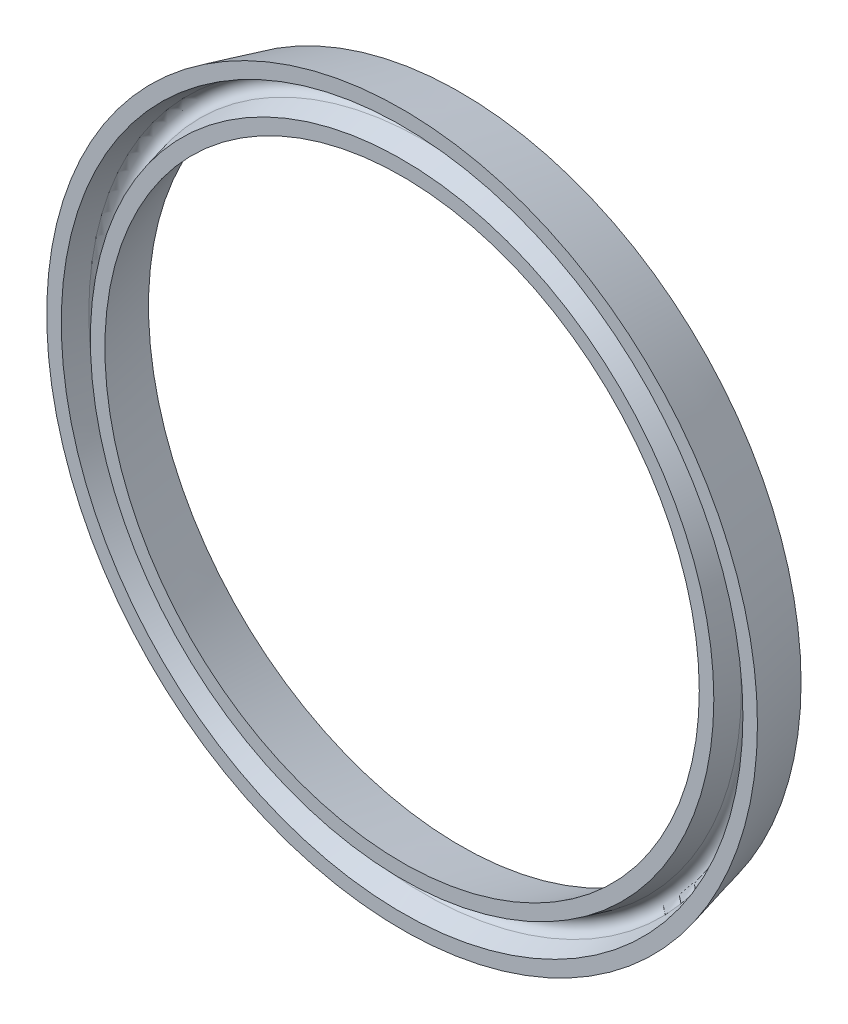
ISO-10303-21;
HEADER;
FILE_DESCRIPTION(('STEP AP214'),'2;1');
FILE_NAME('part.step','',(''),(''),'','','');
FILE_SCHEMA(('AUTOMOTIVE_DESIGN { 1 0 10303 214 1 1 1 1 }'));
ENDSEC;
DATA;
#1=APPLICATION_CONTEXT('core data for automotive mechanical design processes');
#2=APPLICATION_PROTOCOL_DEFINITION('international standard','automotive_design',2000,#1);
#3=PRODUCT_CONTEXT('',#1,'mechanical');
#4=PRODUCT('Part','Part','',(#3));
#5=PRODUCT_RELATED_PRODUCT_CATEGORY('part','',(#4));
#6=PRODUCT_DEFINITION_FORMATION('','',#4);
#7=PRODUCT_DEFINITION_CONTEXT('part definition',#1,'design');
#8=PRODUCT_DEFINITION('design','',#6,#7);
#9=PRODUCT_DEFINITION_SHAPE('','',#8);
#10=(LENGTH_UNIT() NAMED_UNIT(*) SI_UNIT(.MILLI.,.METRE.));
#11=(NAMED_UNIT(*) PLANE_ANGLE_UNIT() SI_UNIT($,.RADIAN.));
#12=(NAMED_UNIT(*) SI_UNIT($,.STERADIAN.) SOLID_ANGLE_UNIT());
#13=UNCERTAINTY_MEASURE_WITH_UNIT(LENGTH_MEASURE(1.E-05),#10,'distance_accuracy_value','');
#14=(GEOMETRIC_REPRESENTATION_CONTEXT(3) GLOBAL_UNCERTAINTY_ASSIGNED_CONTEXT((#13)) GLOBAL_UNIT_ASSIGNED_CONTEXT((#10,
#11,#12)) REPRESENTATION_CONTEXT('',''));
#15=CARTESIAN_POINT('',(0.,0.,0.));
#16=DIRECTION('',(0.,0.,1.));
#17=DIRECTION('',(1.,0.,0.));
#18=AXIS2_PLACEMENT_3D('',#15,#16,#17);
#19=CARTESIAN_POINT('',(-67.31,0.,6.));
#20=DIRECTION('',(0.,0.,-1.));
#21=DIRECTION('',(-1.,0.,0.));
#22=AXIS2_PLACEMENT_3D('',#19,#20,#21);
#23=CONICAL_SURFACE('',#22,64.31,0.244978663126864);
#24=CARTESIAN_POINT('',(-67.31,0.,1.455213750218));
#25=DIRECTION('',(0.,0.,1.));
#26=DIRECTION('',(1.,0.,0.));
#27=AXIS2_PLACEMENT_3D('',#24,#25,#26);
#28=CIRCLE('',#27,65.4461965624455);
#29=CARTESIAN_POINT('',(-1.8638034375545,0.,1.455213750218));
#30=VERTEX_POINT('',#29);
#31=EDGE_CURVE('E10',#30,#30,#28,.T.);
#32=ORIENTED_EDGE('',*,*,#31,.T.);
#33=EDGE_LOOP('',(#32));
#34=FACE_BOUND('',#33,.T.);
#35=CARTESIAN_POINT('',(-67.31,0.,6.));
#36=DIRECTION('',(0.,0.,1.));
#37=DIRECTION('',(1.,0.,0.));
#38=AXIS2_PLACEMENT_3D('',#35,#36,#37);
#39=CIRCLE('',#38,64.31);
#40=CARTESIAN_POINT('',(-3.,0.,6.));
#41=VERTEX_POINT('',#40);
#42=EDGE_CURVE('E76',#41,#41,#39,.T.);
#43=ORIENTED_EDGE('',*,*,#42,.F.);
#44=EDGE_LOOP('',(#43));
#45=FACE_BOUND('',#44,.T.);
#46=ADVANCED_FACE('F41',(#34,#45),#23,.T.);
#47=CARTESIAN_POINT('',(-67.31,0.,1.92116460960662));
#48=DIRECTION('',(0.,0.,1.));
#49=DIRECTION('',(1.,0.,0.));
#50=AXIS2_PLACEMENT_3D('',#47,#48,#49);
#51=TOROIDAL_SURFACE('',#50,67.31,1.92116460960662);
#52=CARTESIAN_POINT('',(-67.31,0.,1.455213750218));
#53=DIRECTION('',(0.,0.,1.));
#54=DIRECTION('',(1.,0.,0.));
#55=AXIS2_PLACEMENT_3D('',#52,#53,#54);
#56=CIRCLE('',#55,69.1738034375545);
#57=CARTESIAN_POINT('',(1.8638034375545,0.,1.455213750218));
#58=VERTEX_POINT('',#57);
#59=EDGE_CURVE('E48',#58,#58,#56,.T.);
#60=ORIENTED_EDGE('',*,*,#59,.T.);
#61=EDGE_LOOP('',(#60));
#62=FACE_BOUND('',#61,.T.);
#63=ORIENTED_EDGE('',*,*,#31,.F.);
#64=EDGE_LOOP('',(#63));
#65=FACE_BOUND('',#64,.T.);
#66=ADVANCED_FACE('F85',(#62,#65),#51,.F.);
#67=CARTESIAN_POINT('',(-67.31,0.,1.455213750218));
#68=DIRECTION('',(0.,0.,1.));
#69=DIRECTION('',(1.,0.,0.));
#70=AXIS2_PLACEMENT_3D('',#67,#68,#69);
#71=CONICAL_SURFACE('',#70,69.1738034375545,0.244978663126864);
#72=CARTESIAN_POINT('',(-67.31,0.,6.));
#73=DIRECTION('',(0.,0.,1.));
#74=DIRECTION('',(1.,0.,0.));
#75=AXIS2_PLACEMENT_3D('',#72,#73,#74);
#76=CIRCLE('',#75,70.31);
#77=CARTESIAN_POINT('',(3.,0.,6.));
#78=VERTEX_POINT('',#77);
#79=EDGE_CURVE('E53',#78,#78,#76,.T.);
#80=ORIENTED_EDGE('',*,*,#79,.T.);
#81=EDGE_LOOP('',(#80));
#82=FACE_BOUND('',#81,.T.);
#83=ORIENTED_EDGE('',*,*,#59,.F.);
#84=EDGE_LOOP('',(#83));
#85=FACE_BOUND('',#84,.T.);
#86=ADVANCED_FACE('F89',(#82,#85),#71,.F.);
#87=CARTESIAN_POINT('',(0.,0.,6.));
#88=DIRECTION('',(0.,0.,1.));
#89=DIRECTION('',(1.,0.,0.));
#90=AXIS2_PLACEMENT_3D('',#87,#88,#89);
#91=PLANE('',#90);
#92=CARTESIAN_POINT('',(-67.31,0.,6.));
#93=DIRECTION('',(0.,0.,1.));
#94=DIRECTION('',(1.,0.,0.));
#95=AXIS2_PLACEMENT_3D('',#92,#93,#94);
#96=CIRCLE('',#95,73.31);
#97=CARTESIAN_POINT('',(6.00000000000001,0.,6.));
#98=VERTEX_POINT('',#97);
#99=EDGE_CURVE('E58',#98,#98,#96,.T.);
#100=ORIENTED_EDGE('',*,*,#99,.T.);
#101=EDGE_LOOP('',(#100));
#102=FACE_BOUND('',#101,.T.);
#103=ORIENTED_EDGE('',*,*,#79,.F.);
#104=EDGE_LOOP('',(#103));
#105=FACE_BOUND('',#104,.T.);
#106=ADVANCED_FACE('F93',(#102,#105),#91,.T.);
#107=CARTESIAN_POINT('',(-67.31,0.,-6.));
#108=DIRECTION('',(0.,0.,1.));
#109=DIRECTION('',(1.,0.,0.));
#110=AXIS2_PLACEMENT_3D('',#107,#108,#109);
#111=CONICAL_SURFACE('',#110,70.31,0.244978663126864);
#112=ORIENTED_EDGE('',*,*,#99,.F.);
#113=EDGE_LOOP('',(#112));
#114=FACE_BOUND('',#113,.T.);
#115=CARTESIAN_POINT('',(-67.31,0.,-6.));
#116=DIRECTION('',(0.,0.,1.));
#117=DIRECTION('',(1.,0.,0.));
#118=AXIS2_PLACEMENT_3D('',#115,#116,#117);
#119=CIRCLE('',#118,70.31);
#120=CARTESIAN_POINT('',(3.,0.,-6.));
#121=VERTEX_POINT('',#120);
#122=EDGE_CURVE('E64',#121,#121,#119,.T.);
#123=ORIENTED_EDGE('',*,*,#122,.T.);
#124=EDGE_LOOP('',(#123));
#125=FACE_BOUND('',#124,.T.);
#126=ADVANCED_FACE('F100',(#114,#125),#111,.T.);
#127=CARTESIAN_POINT('',(0.,0.,-6.));
#128=DIRECTION('',(0.,0.,1.));
#129=DIRECTION('',(1.,0.,0.));
#130=AXIS2_PLACEMENT_3D('',#127,#128,#129);
#131=PLANE('',#130);
#132=ORIENTED_EDGE('',*,*,#122,.F.);
#133=EDGE_LOOP('',(#132));
#134=FACE_BOUND('',#133,.T.);
#135=CARTESIAN_POINT('',(-67.31,0.,-6.));
#136=DIRECTION('',(0.,0.,1.));
#137=DIRECTION('',(1.,0.,0.));
#138=AXIS2_PLACEMENT_3D('',#135,#136,#137);
#139=CIRCLE('',#138,64.31);
#140=CARTESIAN_POINT('',(-3.,0.,-6.));
#141=VERTEX_POINT('',#140);
#142=EDGE_CURVE('E68',#141,#141,#139,.T.);
#143=ORIENTED_EDGE('',*,*,#142,.T.);
#144=EDGE_LOOP('',(#143));
#145=FACE_BOUND('',#144,.T.);
#146=ADVANCED_FACE('F104',(#134,#145),#131,.F.);
#147=CARTESIAN_POINT('',(-67.31,0.,-6.));
#148=DIRECTION('',(0.,0.,-1.));
#149=DIRECTION('',(-1.,0.,0.));
#150=AXIS2_PLACEMENT_3D('',#147,#148,#149);
#151=CONICAL_SURFACE('',#150,64.31,0.244978663126864);
#152=CARTESIAN_POINT('',(-67.31,0.,6.));
#153=DIRECTION('',(0.,0.,1.));
#154=DIRECTION('',(1.,0.,0.));
#155=AXIS2_PLACEMENT_3D('',#152,#153,#154);
#156=CIRCLE('',#155,61.31);
#157=CARTESIAN_POINT('',(-6.,0.,6.));
#158=VERTEX_POINT('',#157);
#159=EDGE_CURVE('E72',#158,#158,#156,.T.);
#160=ORIENTED_EDGE('',*,*,#159,.T.);
#161=EDGE_LOOP('',(#160));
#162=FACE_BOUND('',#161,.T.);
#163=ORIENTED_EDGE('',*,*,#142,.F.);
#164=EDGE_LOOP('',(#163));
#165=FACE_BOUND('',#164,.T.);
#166=ADVANCED_FACE('F108',(#162,#165),#151,.F.);
#167=CARTESIAN_POINT('',(0.,0.,6.));
#168=DIRECTION('',(0.,0.,1.));
#169=DIRECTION('',(1.,0.,0.));
#170=AXIS2_PLACEMENT_3D('',#167,#168,#169);
#171=PLANE('',#170);
#172=ORIENTED_EDGE('',*,*,#42,.T.);
#173=EDGE_LOOP('',(#172));
#174=FACE_BOUND('',#173,.T.);
#175=ORIENTED_EDGE('',*,*,#159,.F.);
#176=EDGE_LOOP('',(#175));
#177=FACE_BOUND('',#176,.T.);
#178=ADVANCED_FACE('F81',(#174,#177),#171,.T.);
#179=CLOSED_SHELL('',(#46,#66,#86,#106,#126,#146,#166,#178));
#180=MANIFOLD_SOLID_BREP('B2',#179);
#181=ADVANCED_BREP_SHAPE_REPRESENTATION('',(#18,#180),#14);
#182=SHAPE_DEFINITION_REPRESENTATION(#9,#181);
ENDSEC;
END-ISO-10303-21;
